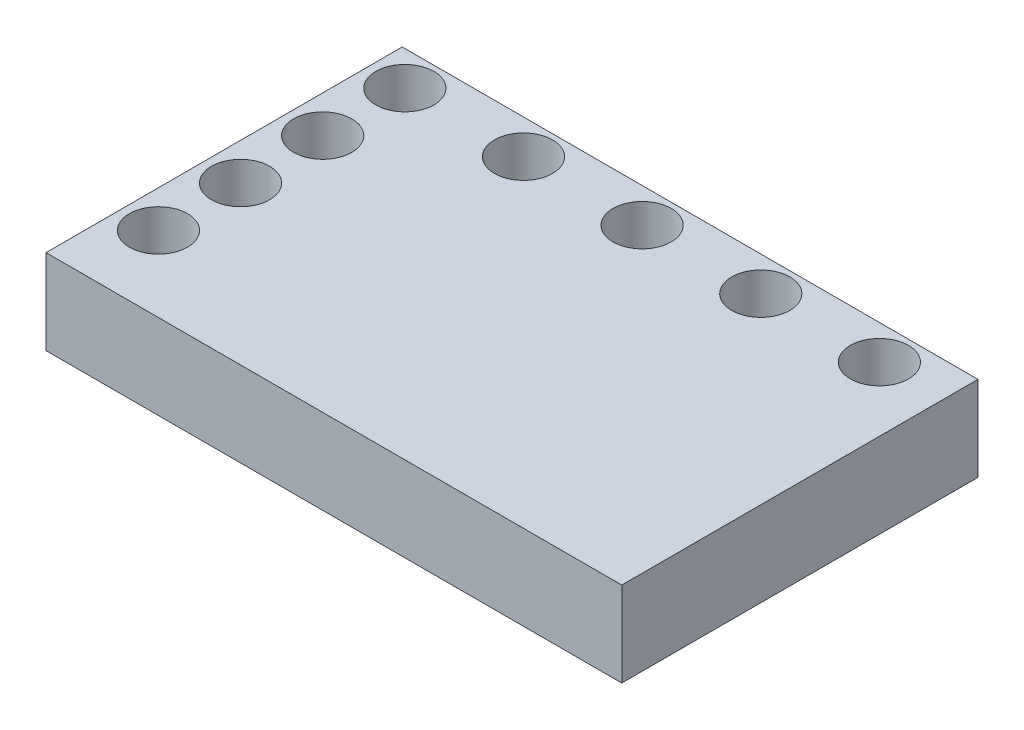
ISO-10303-21;
HEADER;
FILE_DESCRIPTION(('STEP AP214'),'2;1');
FILE_NAME('part.step','',(''),(''),'','','');
FILE_SCHEMA(('AUTOMOTIVE_DESIGN { 1 0 10303 214 1 1 1 1 }'));
ENDSEC;
DATA;
#1=APPLICATION_CONTEXT('core data for automotive mechanical design processes');
#2=APPLICATION_PROTOCOL_DEFINITION('international standard','automotive_design',2000,#1);
#3=PRODUCT_CONTEXT('',#1,'mechanical');
#4=PRODUCT('Part','Part','',(#3));
#5=PRODUCT_RELATED_PRODUCT_CATEGORY('part','',(#4));
#6=PRODUCT_DEFINITION_FORMATION('','',#4);
#7=PRODUCT_DEFINITION_CONTEXT('part definition',#1,'design');
#8=PRODUCT_DEFINITION('design','',#6,#7);
#9=PRODUCT_DEFINITION_SHAPE('','',#8);
#10=(LENGTH_UNIT() NAMED_UNIT(*) SI_UNIT(.MILLI.,.METRE.));
#11=(NAMED_UNIT(*) PLANE_ANGLE_UNIT() SI_UNIT($,.RADIAN.));
#12=(NAMED_UNIT(*) SI_UNIT($,.STERADIAN.) SOLID_ANGLE_UNIT());
#13=UNCERTAINTY_MEASURE_WITH_UNIT(LENGTH_MEASURE(1.E-05),#10,'distance_accuracy_value','');
#14=(GEOMETRIC_REPRESENTATION_CONTEXT(3) GLOBAL_UNCERTAINTY_ASSIGNED_CONTEXT((#13)) GLOBAL_UNIT_ASSIGNED_CONTEXT((#10,
#11,#12)) REPRESENTATION_CONTEXT('',''));
#15=CARTESIAN_POINT('',(0.,0.,0.));
#16=DIRECTION('',(0.,0.,1.));
#17=DIRECTION('',(1.,0.,0.));
#18=AXIS2_PLACEMENT_3D('',#15,#16,#17);
#19=CARTESIAN_POINT('',(-125.445944564902,-23.622,110.2886926433));
#20=DIRECTION('',(0.,1.,0.));
#21=DIRECTION('',(0.,0.,1.));
#22=AXIS2_PLACEMENT_3D('',#19,#20,#21);
#23=CYLINDRICAL_SURFACE('',#22,16.1823039520215);
#24=CARTESIAN_POINT('',(-125.445944564902,-23.622,110.2886926433));
#25=DIRECTION('',(0.,1.,0.));
#26=DIRECTION('',(0.,0.,1.));
#27=AXIS2_PLACEMENT_3D('',#24,#25,#26);
#28=CIRCLE('',#27,16.1823039520215);
#29=CARTESIAN_POINT('',(-125.445944564902,-23.622,126.470996595322));
#30=VERTEX_POINT('',#29);
#31=EDGE_CURVE('E41',#30,#30,#28,.T.);
#32=ORIENTED_EDGE('',*,*,#31,.F.);
#33=EDGE_LOOP('',(#32));
#34=FACE_BOUND('',#33,.T.);
#35=CARTESIAN_POINT('',(-125.445944564902,23.622,110.2886926433));
#36=DIRECTION('',(0.,1.,0.));
#37=DIRECTION('',(0.,0.,1.));
#38=AXIS2_PLACEMENT_3D('',#35,#36,#37);
#39=CIRCLE('',#38,16.1823039520215);
#40=CARTESIAN_POINT('',(-125.445944564902,23.622,126.470996595322));
#41=VERTEX_POINT('',#40);
#42=EDGE_CURVE('E11',#41,#41,#39,.T.);
#43=ORIENTED_EDGE('',*,*,#42,.T.);
#44=EDGE_LOOP('',(#43));
#45=FACE_BOUND('',#44,.T.);
#46=ADVANCED_FACE('F33',(#34,#45),#23,.F.);
#47=CARTESIAN_POINT('',(-125.445944564902,-23.622,64.5686926433001));
#48=DIRECTION('',(0.,1.,0.));
#49=DIRECTION('',(0.,0.,1.));
#50=AXIS2_PLACEMENT_3D('',#47,#48,#49);
#51=CYLINDRICAL_SURFACE('',#50,16.1823039520215);
#52=CARTESIAN_POINT('',(-125.445944564902,-23.622,64.5686926433001));
#53=DIRECTION('',(0.,1.,0.));
#54=DIRECTION('',(0.,0.,1.));
#55=AXIS2_PLACEMENT_3D('',#52,#53,#54);
#56=CIRCLE('',#55,16.1823039520215);
#57=CARTESIAN_POINT('',(-125.445944564902,-23.622,80.7509965953215));
#58=VERTEX_POINT('',#57);
#59=EDGE_CURVE('E135',#58,#58,#56,.T.);
#60=ORIENTED_EDGE('',*,*,#59,.F.);
#61=EDGE_LOOP('',(#60));
#62=FACE_BOUND('',#61,.T.);
#63=CARTESIAN_POINT('',(-125.445944564902,23.622,64.5686926433001));
#64=DIRECTION('',(0.,1.,0.));
#65=DIRECTION('',(0.,0.,1.));
#66=AXIS2_PLACEMENT_3D('',#63,#64,#65);
#67=CIRCLE('',#66,16.1823039520215);
#68=CARTESIAN_POINT('',(-125.445944564902,23.622,80.7509965953215));
#69=VERTEX_POINT('',#68);
#70=EDGE_CURVE('E138',#69,#69,#67,.T.);
#71=ORIENTED_EDGE('',*,*,#70,.T.);
#72=EDGE_LOOP('',(#71));
#73=FACE_BOUND('',#72,.T.);
#74=ADVANCED_FACE('F147',(#62,#73),#51,.F.);
#75=CARTESIAN_POINT('',(-125.445944564902,-23.622,18.8486926433));
#76=DIRECTION('',(0.,1.,0.));
#77=DIRECTION('',(0.,0.,1.));
#78=AXIS2_PLACEMENT_3D('',#75,#76,#77);
#79=CYLINDRICAL_SURFACE('',#78,16.1823039520215);
#80=CARTESIAN_POINT('',(-125.445944564902,-23.622,18.8486926433));
#81=DIRECTION('',(0.,1.,0.));
#82=DIRECTION('',(0.,0.,1.));
#83=AXIS2_PLACEMENT_3D('',#80,#81,#82);
#84=CIRCLE('',#83,16.1823039520215);
#85=CARTESIAN_POINT('',(-125.445944564902,-23.622,35.0309965953215));
#86=VERTEX_POINT('',#85);
#87=EDGE_CURVE('E129',#86,#86,#84,.T.);
#88=ORIENTED_EDGE('',*,*,#87,.F.);
#89=EDGE_LOOP('',(#88));
#90=FACE_BOUND('',#89,.T.);
#91=CARTESIAN_POINT('',(-125.445944564902,23.622,18.8486926433));
#92=DIRECTION('',(0.,1.,0.));
#93=DIRECTION('',(0.,0.,1.));
#94=AXIS2_PLACEMENT_3D('',#91,#92,#93);
#95=CIRCLE('',#94,16.1823039520215);
#96=CARTESIAN_POINT('',(-125.445944564902,23.622,35.0309965953215));
#97=VERTEX_POINT('',#96);
#98=EDGE_CURVE('E132',#97,#97,#95,.T.);
#99=ORIENTED_EDGE('',*,*,#98,.T.);
#100=EDGE_LOOP('',(#99));
#101=FACE_BOUND('',#100,.T.);
#102=ADVANCED_FACE('F186',(#90,#101),#79,.F.);
#103=CARTESIAN_POINT('',(138.714055435098,-23.622,-26.8713073567));
#104=DIRECTION('',(0.,1.,0.));
#105=DIRECTION('',(0.,0.,1.));
#106=AXIS2_PLACEMENT_3D('',#103,#104,#105);
#107=CYLINDRICAL_SURFACE('',#106,16.1823039520215);
#108=CARTESIAN_POINT('',(138.714055435098,-23.622,-26.8713073567));
#109=DIRECTION('',(0.,1.,0.));
#110=DIRECTION('',(0.,0.,1.));
#111=AXIS2_PLACEMENT_3D('',#108,#109,#110);
#112=CIRCLE('',#111,16.1823039520215);
#113=CARTESIAN_POINT('',(138.714055435098,-23.622,-10.6890034046785));
#114=VERTEX_POINT('',#113);
#115=EDGE_CURVE('E123',#114,#114,#112,.T.);
#116=ORIENTED_EDGE('',*,*,#115,.F.);
#117=EDGE_LOOP('',(#116));
#118=FACE_BOUND('',#117,.T.);
#119=CARTESIAN_POINT('',(138.714055435098,23.622,-26.8713073567));
#120=DIRECTION('',(0.,1.,0.));
#121=DIRECTION('',(0.,0.,1.));
#122=AXIS2_PLACEMENT_3D('',#119,#120,#121);
#123=CIRCLE('',#122,16.1823039520215);
#124=CARTESIAN_POINT('',(138.714055435098,23.622,-10.6890034046785));
#125=VERTEX_POINT('',#124);
#126=EDGE_CURVE('E126',#125,#125,#123,.T.);
#127=ORIENTED_EDGE('',*,*,#126,.T.);
#128=EDGE_LOOP('',(#127));
#129=FACE_BOUND('',#128,.T.);
#130=ADVANCED_FACE('F182',(#118,#129),#107,.F.);
#131=CARTESIAN_POINT('',(72.6740554350982,-23.622,-26.8713073567));
#132=DIRECTION('',(0.,1.,0.));
#133=DIRECTION('',(0.,0.,1.));
#134=AXIS2_PLACEMENT_3D('',#131,#132,#133);
#135=CYLINDRICAL_SURFACE('',#134,16.1823039520215);
#136=CARTESIAN_POINT('',(72.6740554350982,-23.622,-26.8713073567));
#137=DIRECTION('',(0.,1.,0.));
#138=DIRECTION('',(0.,0.,1.));
#139=AXIS2_PLACEMENT_3D('',#136,#137,#138);
#140=CIRCLE('',#139,16.1823039520215);
#141=CARTESIAN_POINT('',(72.6740554350982,-23.622,-10.6890034046785));
#142=VERTEX_POINT('',#141);
#143=EDGE_CURVE('E117',#142,#142,#140,.T.);
#144=ORIENTED_EDGE('',*,*,#143,.F.);
#145=EDGE_LOOP('',(#144));
#146=FACE_BOUND('',#145,.T.);
#147=CARTESIAN_POINT('',(72.6740554350982,23.622,-26.8713073567));
#148=DIRECTION('',(0.,1.,0.));
#149=DIRECTION('',(0.,0.,1.));
#150=AXIS2_PLACEMENT_3D('',#147,#148,#149);
#151=CIRCLE('',#150,16.1823039520215);
#152=CARTESIAN_POINT('',(72.6740554350982,23.622,-10.6890034046785));
#153=VERTEX_POINT('',#152);
#154=EDGE_CURVE('E120',#153,#153,#151,.T.);
#155=ORIENTED_EDGE('',*,*,#154,.T.);
#156=EDGE_LOOP('',(#155));
#157=FACE_BOUND('',#156,.T.);
#158=ADVANCED_FACE('F178',(#146,#157),#135,.F.);
#159=CARTESIAN_POINT('',(6.63405543509812,-23.622,-26.8713073567));
#160=DIRECTION('',(0.,1.,0.));
#161=DIRECTION('',(0.,0.,1.));
#162=AXIS2_PLACEMENT_3D('',#159,#160,#161);
#163=CYLINDRICAL_SURFACE('',#162,16.1823039520215);
#164=CARTESIAN_POINT('',(6.63405543509812,-23.622,-26.8713073567));
#165=DIRECTION('',(0.,1.,0.));
#166=DIRECTION('',(0.,0.,1.));
#167=AXIS2_PLACEMENT_3D('',#164,#165,#166);
#168=CIRCLE('',#167,16.1823039520215);
#169=CARTESIAN_POINT('',(6.63405543509812,-23.622,-10.6890034046785));
#170=VERTEX_POINT('',#169);
#171=EDGE_CURVE('E111',#170,#170,#168,.T.);
#172=ORIENTED_EDGE('',*,*,#171,.F.);
#173=EDGE_LOOP('',(#172));
#174=FACE_BOUND('',#173,.T.);
#175=CARTESIAN_POINT('',(6.63405543509812,23.622,-26.8713073567));
#176=DIRECTION('',(0.,1.,0.));
#177=DIRECTION('',(0.,0.,1.));
#178=AXIS2_PLACEMENT_3D('',#175,#176,#177);
#179=CIRCLE('',#178,16.1823039520215);
#180=CARTESIAN_POINT('',(6.63405543509812,23.622,-10.6890034046785));
#181=VERTEX_POINT('',#180);
#182=EDGE_CURVE('E114',#181,#181,#179,.T.);
#183=ORIENTED_EDGE('',*,*,#182,.T.);
#184=EDGE_LOOP('',(#183));
#185=FACE_BOUND('',#184,.T.);
#186=ADVANCED_FACE('F174',(#174,#185),#163,.F.);
#187=CARTESIAN_POINT('',(-146.037348536964,23.622,-46.0153654757993));
#188=DIRECTION('',(1.,0.,0.));
#189=DIRECTION('',(0.,0.,-1.));
#190=AXIS2_PLACEMENT_3D('',#187,#188,#189);
#191=PLANE('',#190);
#192=DIRECTION('',(0.,0.,1.));
#193=VECTOR('',#192,1.);
#194=CARTESIAN_POINT('',(-146.037348536964,-23.622,-46.0153654757993));
#195=LINE('',#194,#193);
#196=CARTESIAN_POINT('',(-146.037348536964,-23.622,-46.0153654757993));
#197=VERTEX_POINT('',#196);
#198=CARTESIAN_POINT('',(-146.037348536964,-23.622,152.270448953004));
#199=VERTEX_POINT('',#198);
#200=EDGE_CURVE('E101',#197,#199,#195,.T.);
#201=ORIENTED_EDGE('',*,*,#200,.T.);
#202=DIRECTION('',(0.,-1.,0.));
#203=VECTOR('',#202,1.);
#204=CARTESIAN_POINT('',(-146.037348536964,23.622,152.270448953004));
#205=LINE('',#204,#203);
#206=CARTESIAN_POINT('',(-146.037348536964,23.622,152.270448953004));
#207=VERTEX_POINT('',#206);
#208=EDGE_CURVE('E92',#207,#199,#205,.T.);
#209=ORIENTED_EDGE('',*,*,#208,.F.);
#210=DIRECTION('',(0.,0.,1.));
#211=VECTOR('',#210,1.);
#212=CARTESIAN_POINT('',(-146.037348536964,23.622,-46.0153654757993));
#213=LINE('',#212,#211);
#214=CARTESIAN_POINT('',(-146.037348536964,23.622,-46.0153654757993));
#215=VERTEX_POINT('',#214);
#216=EDGE_CURVE('E86',#215,#207,#213,.T.);
#217=ORIENTED_EDGE('',*,*,#216,.F.);
#218=DIRECTION('',(0.,-1.,0.));
#219=VECTOR('',#218,1.);
#220=CARTESIAN_POINT('',(-146.037348536964,23.622,-46.0153654757993));
#221=LINE('',#220,#219);
#222=EDGE_CURVE('E97',#215,#197,#221,.T.);
#223=ORIENTED_EDGE('',*,*,#222,.T.);
#224=EDGE_LOOP('',(#201,#209,#217,#223));
#225=FACE_BOUND('',#224,.T.);
#226=ADVANCED_FACE('F171',(#225),#191,.F.);
#227=CARTESIAN_POINT('',(-146.037348536964,23.622,152.270448953004));
#228=DIRECTION('',(0.,0.,-1.));
#229=DIRECTION('',(-1.,0.,0.));
#230=AXIS2_PLACEMENT_3D('',#227,#228,#229);
#231=PLANE('',#230);
#232=DIRECTION('',(1.,0.,0.));
#233=VECTOR('',#232,1.);
#234=CARTESIAN_POINT('',(-146.037348536964,-23.622,152.270448953004));
#235=LINE('',#234,#233);
#236=CARTESIAN_POINT('',(174.437393178977,-23.622,152.270448953004));
#237=VERTEX_POINT('',#236);
#238=EDGE_CURVE('E91',#199,#237,#235,.T.);
#239=ORIENTED_EDGE('',*,*,#238,.T.);
#240=DIRECTION('',(0.,-1.,0.));
#241=VECTOR('',#240,1.);
#242=CARTESIAN_POINT('',(174.437393178977,23.622,152.270448953004));
#243=LINE('',#242,#241);
#244=CARTESIAN_POINT('',(174.437393178977,23.622,152.270448953004));
#245=VERTEX_POINT('',#244);
#246=EDGE_CURVE('E89',#245,#237,#243,.T.);
#247=ORIENTED_EDGE('',*,*,#246,.F.);
#248=DIRECTION('',(1.,0.,0.));
#249=VECTOR('',#248,1.);
#250=CARTESIAN_POINT('',(-146.037348536964,23.622,152.270448953004));
#251=LINE('',#250,#249);
#252=EDGE_CURVE('E80',#207,#245,#251,.T.);
#253=ORIENTED_EDGE('',*,*,#252,.F.);
#254=ORIENTED_EDGE('',*,*,#208,.T.);
#255=EDGE_LOOP('',(#239,#247,#253,#254));
#256=FACE_BOUND('',#255,.T.);
#257=ADVANCED_FACE('F90',(#256),#231,.F.);
#258=CARTESIAN_POINT('',(174.437393178977,23.622,-46.0153654757993));
#259=DIRECTION('',(-1.,0.,0.));
#260=DIRECTION('',(0.,0.,1.));
#261=AXIS2_PLACEMENT_3D('',#258,#259,#260);
#262=PLANE('',#261);
#263=DIRECTION('',(0.,0.,-1.));
#264=VECTOR('',#263,1.);
#265=CARTESIAN_POINT('',(174.437393178977,-23.622,-46.0153654757993));
#266=LINE('',#265,#264);
#267=CARTESIAN_POINT('',(174.437393178977,-23.622,-46.0153654757993));
#268=VERTEX_POINT('',#267);
#269=EDGE_CURVE('E66',#237,#268,#266,.T.);
#270=ORIENTED_EDGE('',*,*,#269,.T.);
#271=DIRECTION('',(0.,-1.,0.));
#272=VECTOR('',#271,1.);
#273=CARTESIAN_POINT('',(174.437393178977,23.622,-46.0153654757993));
#274=LINE('',#273,#272);
#275=CARTESIAN_POINT('',(174.437393178977,23.622,-46.0153654757993));
#276=VERTEX_POINT('',#275);
#277=EDGE_CURVE('E93',#276,#268,#274,.T.);
#278=ORIENTED_EDGE('',*,*,#277,.F.);
#279=DIRECTION('',(0.,0.,-1.));
#280=VECTOR('',#279,1.);
#281=CARTESIAN_POINT('',(174.437393178977,23.622,-46.0153654757993));
#282=LINE('',#281,#280);
#283=EDGE_CURVE('E84',#245,#276,#282,.T.);
#284=ORIENTED_EDGE('',*,*,#283,.F.);
#285=ORIENTED_EDGE('',*,*,#246,.T.);
#286=EDGE_LOOP('',(#270,#278,#284,#285));
#287=FACE_BOUND('',#286,.T.);
#288=ADVANCED_FACE('F95',(#287),#262,.F.);
#289=CARTESIAN_POINT('',(-146.037348536964,23.622,-46.0153654757993));
#290=DIRECTION('',(0.,0.,1.));
#291=DIRECTION('',(1.,0.,0.));
#292=AXIS2_PLACEMENT_3D('',#289,#290,#291);
#293=PLANE('',#292);
#294=DIRECTION('',(-1.,0.,0.));
#295=VECTOR('',#294,1.);
#296=CARTESIAN_POINT('',(-146.037348536964,-23.622,-46.0153654757993));
#297=LINE('',#296,#295);
#298=EDGE_CURVE('E72',#268,#197,#297,.T.);
#299=ORIENTED_EDGE('',*,*,#298,.T.);
#300=ORIENTED_EDGE('',*,*,#222,.F.);
#301=DIRECTION('',(-1.,0.,0.));
#302=VECTOR('',#301,1.);
#303=CARTESIAN_POINT('',(-146.037348536964,23.622,-46.0153654757993));
#304=LINE('',#303,#302);
#305=EDGE_CURVE('E49',#276,#215,#304,.T.);
#306=ORIENTED_EDGE('',*,*,#305,.F.);
#307=ORIENTED_EDGE('',*,*,#277,.T.);
#308=EDGE_LOOP('',(#299,#300,#306,#307));
#309=FACE_BOUND('',#308,.T.);
#310=ADVANCED_FACE('F151',(#309),#293,.F.);
#311=CARTESIAN_POINT('',(0.,23.622,0.));
#312=DIRECTION('',(0.,1.,0.));
#313=DIRECTION('',(0.,0.,1.));
#314=AXIS2_PLACEMENT_3D('',#311,#312,#313);
#315=PLANE('',#314);
#316=CARTESIAN_POINT('',(-59.4059445649019,23.622,-26.8713073567));
#317=DIRECTION('',(0.,1.,0.));
#318=DIRECTION('',(0.,0.,1.));
#319=AXIS2_PLACEMENT_3D('',#316,#317,#318);
#320=CIRCLE('',#319,16.1823039520215);
#321=CARTESIAN_POINT('',(-59.4059445649019,23.622,-10.6890034046785));
#322=VERTEX_POINT('',#321);
#323=EDGE_CURVE('E283',#322,#322,#320,.T.);
#324=ORIENTED_EDGE('',*,*,#323,.F.);
#325=EDGE_LOOP('',(#324));
#326=FACE_BOUND('',#325,.T.);
#327=CARTESIAN_POINT('',(-125.445944564902,23.622,-26.8713073567));
#328=DIRECTION('',(0.,1.,0.));
#329=DIRECTION('',(0.,0.,1.));
#330=AXIS2_PLACEMENT_3D('',#327,#328,#329);
#331=CIRCLE('',#330,16.1823039520215);
#332=CARTESIAN_POINT('',(-125.445944564902,23.622,-10.6890034046785));
#333=VERTEX_POINT('',#332);
#334=EDGE_CURVE('E284',#333,#333,#331,.T.);
#335=ORIENTED_EDGE('',*,*,#334,.F.);
#336=EDGE_LOOP('',(#335));
#337=FACE_BOUND('',#336,.T.);
#338=ORIENTED_EDGE('',*,*,#216,.T.);
#339=ORIENTED_EDGE('',*,*,#252,.T.);
#340=ORIENTED_EDGE('',*,*,#283,.T.);
#341=ORIENTED_EDGE('',*,*,#305,.T.);
#342=EDGE_LOOP('',(#338,#339,#340,#341));
#343=FACE_BOUND('',#342,.T.);
#344=ORIENTED_EDGE('',*,*,#182,.F.);
#345=EDGE_LOOP('',(#344));
#346=FACE_BOUND('',#345,.T.);
#347=ORIENTED_EDGE('',*,*,#154,.F.);
#348=EDGE_LOOP('',(#347));
#349=FACE_BOUND('',#348,.T.);
#350=ORIENTED_EDGE('',*,*,#126,.F.);
#351=EDGE_LOOP('',(#350));
#352=FACE_BOUND('',#351,.T.);
#353=ORIENTED_EDGE('',*,*,#98,.F.);
#354=EDGE_LOOP('',(#353));
#355=FACE_BOUND('',#354,.T.);
#356=ORIENTED_EDGE('',*,*,#70,.F.);
#357=EDGE_LOOP('',(#356));
#358=FACE_BOUND('',#357,.T.);
#359=ORIENTED_EDGE('',*,*,#42,.F.);
#360=EDGE_LOOP('',(#359));
#361=FACE_BOUND('',#360,.T.);
#362=ADVANCED_FACE('F81',(#326,#337,#343,#346,#349,#352,#355,#358,#361),#315,.T.);
#363=CARTESIAN_POINT('',(0.,-23.622,0.));
#364=DIRECTION('',(0.,1.,0.));
#365=DIRECTION('',(0.,0.,1.));
#366=AXIS2_PLACEMENT_3D('',#363,#364,#365);
#367=PLANE('',#366);
#368=CARTESIAN_POINT('',(-59.4059445649019,-23.622,-26.8713073567));
#369=DIRECTION('',(0.,1.,0.));
#370=DIRECTION('',(0.,0.,1.));
#371=AXIS2_PLACEMENT_3D('',#368,#369,#370);
#372=CIRCLE('',#371,16.1823039520215);
#373=CARTESIAN_POINT('',(-59.4059445649019,-23.622,-10.6890034046785));
#374=VERTEX_POINT('',#373);
#375=EDGE_CURVE('E281',#374,#374,#372,.T.);
#376=ORIENTED_EDGE('',*,*,#375,.T.);
#377=EDGE_LOOP('',(#376));
#378=FACE_BOUND('',#377,.T.);
#379=CARTESIAN_POINT('',(-125.445944564902,-23.622,-26.8713073567));
#380=DIRECTION('',(0.,1.,0.));
#381=DIRECTION('',(0.,0.,1.));
#382=AXIS2_PLACEMENT_3D('',#379,#380,#381);
#383=CIRCLE('',#382,16.1823039520215);
#384=CARTESIAN_POINT('',(-125.445944564902,-23.622,-10.6890034046785));
#385=VERTEX_POINT('',#384);
#386=EDGE_CURVE('E104',#385,#385,#383,.T.);
#387=ORIENTED_EDGE('',*,*,#386,.T.);
#388=EDGE_LOOP('',(#387));
#389=FACE_BOUND('',#388,.T.);
#390=ORIENTED_EDGE('',*,*,#200,.F.);
#391=ORIENTED_EDGE('',*,*,#298,.F.);
#392=ORIENTED_EDGE('',*,*,#269,.F.);
#393=ORIENTED_EDGE('',*,*,#238,.F.);
#394=EDGE_LOOP('',(#390,#391,#392,#393));
#395=FACE_BOUND('',#394,.T.);
#396=ORIENTED_EDGE('',*,*,#171,.T.);
#397=EDGE_LOOP('',(#396));
#398=FACE_BOUND('',#397,.T.);
#399=ORIENTED_EDGE('',*,*,#143,.T.);
#400=EDGE_LOOP('',(#399));
#401=FACE_BOUND('',#400,.T.);
#402=ORIENTED_EDGE('',*,*,#115,.T.);
#403=EDGE_LOOP('',(#402));
#404=FACE_BOUND('',#403,.T.);
#405=ORIENTED_EDGE('',*,*,#87,.T.);
#406=EDGE_LOOP('',(#405));
#407=FACE_BOUND('',#406,.T.);
#408=ORIENTED_EDGE('',*,*,#59,.T.);
#409=EDGE_LOOP('',(#408));
#410=FACE_BOUND('',#409,.T.);
#411=ORIENTED_EDGE('',*,*,#31,.T.);
#412=EDGE_LOOP('',(#411));
#413=FACE_BOUND('',#412,.T.);
#414=ADVANCED_FACE('F143',(#378,#389,#395,#398,#401,#404,#407,#410,#413),#367,.F.);
#415=CARTESIAN_POINT('',(-125.445944564902,-23.622,-26.8713073567));
#416=DIRECTION('',(0.,1.,0.));
#417=DIRECTION('',(0.,0.,1.));
#418=AXIS2_PLACEMENT_3D('',#415,#416,#417);
#419=CYLINDRICAL_SURFACE('',#418,16.1823039520215);
#420=ORIENTED_EDGE('',*,*,#386,.F.);
#421=EDGE_LOOP('',(#420));
#422=FACE_BOUND('',#421,.T.);
#423=ORIENTED_EDGE('',*,*,#334,.T.);
#424=EDGE_LOOP('',(#423));
#425=FACE_BOUND('',#424,.T.);
#426=ADVANCED_FACE('F158',(#422,#425),#419,.F.);
#427=CARTESIAN_POINT('',(-59.4059445649019,-23.622,-26.8713073567));
#428=DIRECTION('',(0.,1.,0.));
#429=DIRECTION('',(0.,0.,1.));
#430=AXIS2_PLACEMENT_3D('',#427,#428,#429);
#431=CYLINDRICAL_SURFACE('',#430,16.1823039520215);
#432=ORIENTED_EDGE('',*,*,#375,.F.);
#433=EDGE_LOOP('',(#432));
#434=FACE_BOUND('',#433,.T.);
#435=ORIENTED_EDGE('',*,*,#323,.T.);
#436=EDGE_LOOP('',(#435));
#437=FACE_BOUND('',#436,.T.);
#438=ADVANCED_FACE('F242',(#434,#437),#431,.F.);
#439=CLOSED_SHELL('',(#46,#74,#102,#130,#158,#186,#226,#257,#288,#310,#362,#414,#426,#438));
#440=MANIFOLD_SOLID_BREP('B2',#439);
#441=ADVANCED_BREP_SHAPE_REPRESENTATION('',(#18,#440),#14);
#442=SHAPE_DEFINITION_REPRESENTATION(#9,#441);
ENDSEC;
END-ISO-10303-21;
